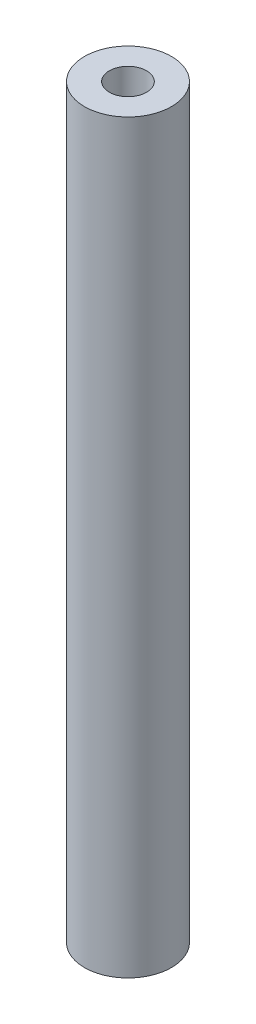
ISO-10303-21;
HEADER;
FILE_DESCRIPTION(('STEP AP214'),'2;1');
FILE_NAME('part.step','',(''),(''),'','','');
FILE_SCHEMA(('AUTOMOTIVE_DESIGN { 1 0 10303 214 1 1 1 1 }'));
ENDSEC;
DATA;
#1=APPLICATION_CONTEXT('core data for automotive mechanical design processes');
#2=APPLICATION_PROTOCOL_DEFINITION('international standard','automotive_design',2000,#1);
#3=PRODUCT_CONTEXT('',#1,'mechanical');
#4=PRODUCT('Part','Part','',(#3));
#5=PRODUCT_RELATED_PRODUCT_CATEGORY('part','',(#4));
#6=PRODUCT_DEFINITION_FORMATION('','',#4);
#7=PRODUCT_DEFINITION_CONTEXT('part definition',#1,'design');
#8=PRODUCT_DEFINITION('design','',#6,#7);
#9=PRODUCT_DEFINITION_SHAPE('','',#8);
#10=(LENGTH_UNIT() NAMED_UNIT(*) SI_UNIT(.MILLI.,.METRE.));
#11=(NAMED_UNIT(*) PLANE_ANGLE_UNIT() SI_UNIT($,.RADIAN.));
#12=(NAMED_UNIT(*) SI_UNIT($,.STERADIAN.) SOLID_ANGLE_UNIT());
#13=UNCERTAINTY_MEASURE_WITH_UNIT(LENGTH_MEASURE(1.E-05),#10,'distance_accuracy_value','');
#14=(GEOMETRIC_REPRESENTATION_CONTEXT(3) GLOBAL_UNCERTAINTY_ASSIGNED_CONTEXT((#13)) GLOBAL_UNIT_ASSIGNED_CONTEXT((#10,
#11,#12)) REPRESENTATION_CONTEXT('',''));
#15=CARTESIAN_POINT('',(0.,0.,0.));
#16=DIRECTION('',(0.,0.,1.));
#17=DIRECTION('',(1.,0.,0.));
#18=AXIS2_PLACEMENT_3D('',#15,#16,#17);
#19=CARTESIAN_POINT('',(0.,60.,0.));
#20=DIRECTION('',(0.,1.,0.));
#21=DIRECTION('',(0.,0.,1.));
#22=AXIS2_PLACEMENT_3D('',#19,#20,#21);
#23=PLANE('',#22);
#24=CARTESIAN_POINT('',(0.,60.,0.));
#25=DIRECTION('',(0.,1.,0.));
#26=DIRECTION('',(0.,0.,1.));
#27=AXIS2_PLACEMENT_3D('',#24,#25,#26);
#28=CIRCLE('',#27,3.5);
#29=CARTESIAN_POINT('',(0.,60.,3.5));
#30=VERTEX_POINT('',#29);
#31=EDGE_CURVE('E10',#30,#30,#28,.T.);
#32=ORIENTED_EDGE('',*,*,#31,.T.);
#33=EDGE_LOOP('',(#32));
#34=FACE_BOUND('',#33,.T.);
#35=CARTESIAN_POINT('',(0.,60.,0.));
#36=DIRECTION('',(0.,1.,0.));
#37=DIRECTION('',(0.,0.,1.));
#38=AXIS2_PLACEMENT_3D('',#35,#36,#37);
#39=CIRCLE('',#38,1.5);
#40=CARTESIAN_POINT('',(0.,60.,1.5));
#41=VERTEX_POINT('',#40);
#42=EDGE_CURVE('E48',#41,#41,#39,.T.);
#43=ORIENTED_EDGE('',*,*,#42,.F.);
#44=EDGE_LOOP('',(#43));
#45=FACE_BOUND('',#44,.T.);
#46=ADVANCED_FACE('F37',(#34,#45),#23,.T.);
#47=CARTESIAN_POINT('',(0.,0.,0.));
#48=DIRECTION('',(0.,1.,0.));
#49=DIRECTION('',(0.,0.,1.));
#50=AXIS2_PLACEMENT_3D('',#47,#48,#49);
#51=PLANE('',#50);
#52=CARTESIAN_POINT('',(0.,0.,0.));
#53=DIRECTION('',(0.,1.,0.));
#54=DIRECTION('',(0.,0.,1.));
#55=AXIS2_PLACEMENT_3D('',#52,#53,#54);
#56=CIRCLE('',#55,3.5);
#57=CARTESIAN_POINT('',(0.,0.,3.5));
#58=VERTEX_POINT('',#57);
#59=EDGE_CURVE('E41',#58,#58,#56,.T.);
#60=ORIENTED_EDGE('',*,*,#59,.F.);
#61=EDGE_LOOP('',(#60));
#62=FACE_BOUND('',#61,.T.);
#63=CARTESIAN_POINT('',(0.,0.,0.));
#64=DIRECTION('',(0.,1.,0.));
#65=DIRECTION('',(0.,0.,1.));
#66=AXIS2_PLACEMENT_3D('',#63,#64,#65);
#67=CIRCLE('',#66,1.5);
#68=CARTESIAN_POINT('',(0.,0.,1.5));
#69=VERTEX_POINT('',#68);
#70=EDGE_CURVE('E50',#69,#69,#67,.T.);
#71=ORIENTED_EDGE('',*,*,#70,.T.);
#72=EDGE_LOOP('',(#71));
#73=FACE_BOUND('',#72,.T.);
#74=ADVANCED_FACE('F60',(#62,#73),#51,.F.);
#75=CARTESIAN_POINT('',(0.,60.,0.));
#76=DIRECTION('',(0.,-1.,0.));
#77=DIRECTION('',(0.,0.,-1.));
#78=AXIS2_PLACEMENT_3D('',#75,#76,#77);
#79=CYLINDRICAL_SURFACE('',#78,3.5);
#80=ORIENTED_EDGE('',*,*,#31,.F.);
#81=EDGE_LOOP('',(#80));
#82=FACE_BOUND('',#81,.T.);
#83=ORIENTED_EDGE('',*,*,#59,.T.);
#84=EDGE_LOOP('',(#83));
#85=FACE_BOUND('',#84,.T.);
#86=ADVANCED_FACE('F39',(#82,#85),#79,.T.);
#87=CARTESIAN_POINT('',(0.,60.,0.));
#88=DIRECTION('',(0.,-1.,0.));
#89=DIRECTION('',(0.,0.,-1.));
#90=AXIS2_PLACEMENT_3D('',#87,#88,#89);
#91=CYLINDRICAL_SURFACE('',#90,1.5);
#92=ORIENTED_EDGE('',*,*,#42,.T.);
#93=EDGE_LOOP('',(#92));
#94=FACE_BOUND('',#93,.T.);
#95=ORIENTED_EDGE('',*,*,#70,.F.);
#96=EDGE_LOOP('',(#95));
#97=FACE_BOUND('',#96,.T.);
#98=ADVANCED_FACE('F56',(#94,#97),#91,.F.);
#99=CLOSED_SHELL('',(#46,#74,#86,#98));
#100=MANIFOLD_SOLID_BREP('B2',#99);
#101=ADVANCED_BREP_SHAPE_REPRESENTATION('',(#18,#100),#14);
#102=SHAPE_DEFINITION_REPRESENTATION(#9,#101);
ENDSEC;
END-ISO-10303-21;
